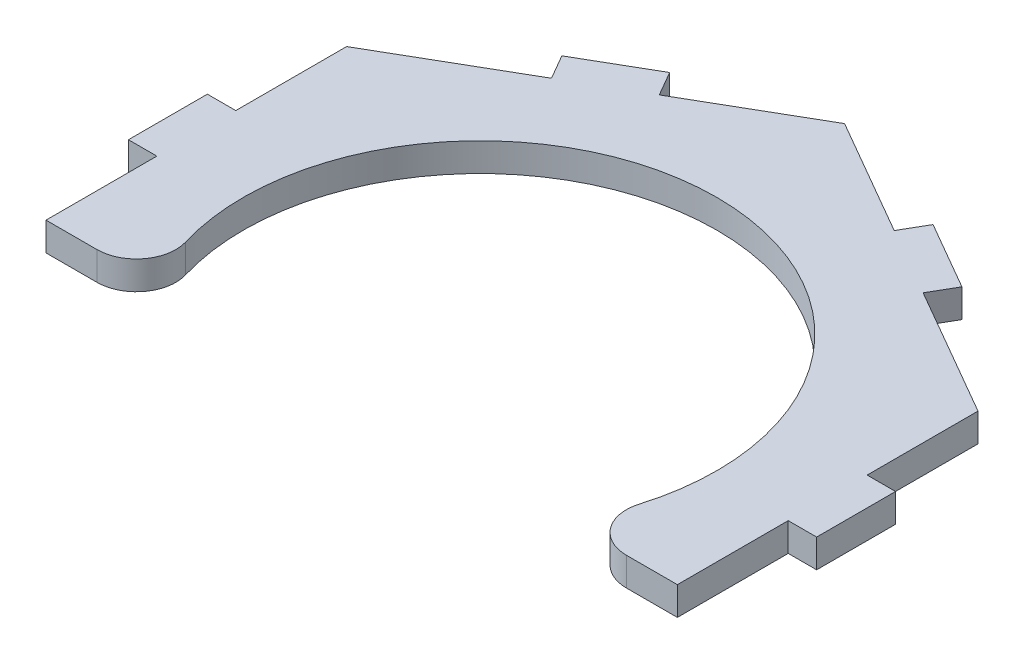
ISO-10303-21;
HEADER;
FILE_DESCRIPTION(('STEP AP214'),'2;1');
FILE_NAME('part.step','',(''),(''),'','','');
FILE_SCHEMA(('AUTOMOTIVE_DESIGN { 1 0 10303 214 1 1 1 1 }'));
ENDSEC;
DATA;
#1=APPLICATION_CONTEXT('core data for automotive mechanical design processes');
#2=APPLICATION_PROTOCOL_DEFINITION('international standard','automotive_design',2000,#1);
#3=PRODUCT_CONTEXT('',#1,'mechanical');
#4=PRODUCT('Part','Part','',(#3));
#5=PRODUCT_RELATED_PRODUCT_CATEGORY('part','',(#4));
#6=PRODUCT_DEFINITION_FORMATION('','',#4);
#7=PRODUCT_DEFINITION_CONTEXT('part definition',#1,'design');
#8=PRODUCT_DEFINITION('design','',#6,#7);
#9=PRODUCT_DEFINITION_SHAPE('','',#8);
#10=(LENGTH_UNIT() NAMED_UNIT(*) SI_UNIT(.MILLI.,.METRE.));
#11=(NAMED_UNIT(*) PLANE_ANGLE_UNIT() SI_UNIT($,.RADIAN.));
#12=(NAMED_UNIT(*) SI_UNIT($,.STERADIAN.) SOLID_ANGLE_UNIT());
#13=UNCERTAINTY_MEASURE_WITH_UNIT(LENGTH_MEASURE(1.E-05),#10,'distance_accuracy_value','');
#14=(GEOMETRIC_REPRESENTATION_CONTEXT(3) GLOBAL_UNCERTAINTY_ASSIGNED_CONTEXT((#13)) GLOBAL_UNIT_ASSIGNED_CONTEXT((#10,
#11,#12)) REPRESENTATION_CONTEXT('',''));
#15=CARTESIAN_POINT('',(0.,0.,0.));
#16=DIRECTION('',(0.,0.,1.));
#17=DIRECTION('',(1.,0.,0.));
#18=AXIS2_PLACEMENT_3D('',#15,#16,#17);
#19=CARTESIAN_POINT('',(50.8,4.572,19.05));
#20=DIRECTION('',(-1.,0.,0.));
#21=DIRECTION('',(0.,0.,1.));
#22=AXIS2_PLACEMENT_3D('',#19,#20,#21);
#23=PLANE('',#22);
#24=DIRECTION('',(0.,1.,0.));
#25=VECTOR('',#24,1.);
#26=CARTESIAN_POINT('',(50.8,0.,-11.4896968374165));
#27=LINE('',#26,#25);
#28=CARTESIAN_POINT('',(50.8,0.,-11.4896968374165));
#29=VERTEX_POINT('',#28);
#30=CARTESIAN_POINT('',(50.8,4.572,-11.4896968374165));
#31=VERTEX_POINT('',#30);
#32=EDGE_CURVE('E214',#29,#31,#27,.T.);
#33=ORIENTED_EDGE('',*,*,#32,.F.);
#34=DIRECTION('',(0.,0.,-1.));
#35=VECTOR('',#34,1.);
#36=CARTESIAN_POINT('',(50.8,0.,19.05));
#37=LINE('',#36,#35);
#38=CARTESIAN_POINT('',(50.8,0.,-29.329393674833));
#39=VERTEX_POINT('',#38);
#40=EDGE_CURVE('E281',#29,#39,#37,.T.);
#41=ORIENTED_EDGE('',*,*,#40,.T.);
#42=DIRECTION('',(0.,-1.,0.));
#43=VECTOR('',#42,1.);
#44=CARTESIAN_POINT('',(50.8,4.572,-29.329393674833));
#45=LINE('',#44,#43);
#46=CARTESIAN_POINT('',(50.8,4.572,-29.329393674833));
#47=VERTEX_POINT('',#46);
#48=EDGE_CURVE('E54',#47,#39,#45,.T.);
#49=ORIENTED_EDGE('',*,*,#48,.F.);
#50=DIRECTION('',(0.,0.,-1.));
#51=VECTOR('',#50,1.);
#52=CARTESIAN_POINT('',(50.8,4.572,19.05));
#53=LINE('',#52,#51);
#54=EDGE_CURVE('E231',#31,#47,#53,.T.);
#55=ORIENTED_EDGE('',*,*,#54,.F.);
#56=EDGE_LOOP('',(#33,#41,#49,#55));
#57=FACE_BOUND('',#56,.T.);
#58=ADVANCED_FACE('F45',(#57),#23,.F.);
#59=CARTESIAN_POINT('',(50.8,4.572,-29.329393674833));
#60=DIRECTION('',(-0.5,0.,0.866025403784439));
#61=DIRECTION('',(0.866025403784439,0.,0.5));
#62=AXIS2_PLACEMENT_3D('',#59,#60,#61);
#63=PLANE('',#62);
#64=DIRECTION('',(-0.866025403784439,0.,-0.5));
#65=VECTOR('',#64,1.);
#66=CARTESIAN_POINT('',(50.8,4.572,-29.329393674833));
#67=LINE('',#66,#65);
#68=CARTESIAN_POINT('',(18.9042843786191,4.572,-47.744393674833));
#69=VERTEX_POINT('',#68);
#70=CARTESIAN_POINT('',(0.,4.572,-58.658787349666));
#71=VERTEX_POINT('',#70);
#72=EDGE_CURVE('E69',#69,#71,#67,.T.);
#73=ORIENTED_EDGE('',*,*,#72,.F.);
#74=DIRECTION('',(0.,1.,0.));
#75=VECTOR('',#74,1.);
#76=CARTESIAN_POINT('',(18.9042843786191,0.,-47.744393674833));
#77=LINE('',#76,#75);
#78=CARTESIAN_POINT('',(18.9042843786191,0.,-47.744393674833));
#79=VERTEX_POINT('',#78);
#80=EDGE_CURVE('E472',#79,#69,#77,.T.);
#81=ORIENTED_EDGE('',*,*,#80,.F.);
#82=DIRECTION('',(-0.866025403784439,0.,-0.5));
#83=VECTOR('',#82,1.);
#84=CARTESIAN_POINT('',(50.8,0.,-29.329393674833));
#85=LINE('',#84,#83);
#86=CARTESIAN_POINT('',(0.,0.,-58.658787349666));
#87=VERTEX_POINT('',#86);
#88=EDGE_CURVE('E287',#79,#87,#85,.T.);
#89=ORIENTED_EDGE('',*,*,#88,.T.);
#90=DIRECTION('',(0.,-1.,0.));
#91=VECTOR('',#90,1.);
#92=CARTESIAN_POINT('',(0.,4.572,-58.658787349666));
#93=LINE('',#92,#91);
#94=EDGE_CURVE('E334',#71,#87,#93,.T.);
#95=ORIENTED_EDGE('',*,*,#94,.F.);
#96=EDGE_LOOP('',(#73,#81,#89,#95));
#97=FACE_BOUND('',#96,.T.);
#98=ADVANCED_FACE('F470',(#97),#63,.F.);
#99=CARTESIAN_POINT('',(0.,4.572,-58.658787349666));
#100=DIRECTION('',(0.5,0.,0.866025403784439));
#101=DIRECTION('',(0.866025403784439,0.,-0.5));
#102=AXIS2_PLACEMENT_3D('',#99,#100,#101);
#103=PLANE('',#102);
#104=DIRECTION('',(-0.866025403784439,0.,0.5));
#105=VECTOR('',#104,1.);
#106=CARTESIAN_POINT('',(0.,4.572,-58.658787349666));
#107=LINE('',#106,#105);
#108=CARTESIAN_POINT('',(-29.9028070066815,4.572,-41.394393674833));
#109=VERTEX_POINT('',#108);
#110=CARTESIAN_POINT('',(-50.8,4.572,-29.329393674833));
#111=VERTEX_POINT('',#110);
#112=EDGE_CURVE('E254',#109,#111,#107,.T.);
#113=ORIENTED_EDGE('',*,*,#112,.F.);
#114=DIRECTION('',(0.,1.,0.));
#115=VECTOR('',#114,1.);
#116=CARTESIAN_POINT('',(-29.9028070066815,0.,-41.394393674833));
#117=LINE('',#116,#115);
#118=CARTESIAN_POINT('',(-29.9028070066815,0.,-41.394393674833));
#119=VERTEX_POINT('',#118);
#120=EDGE_CURVE('E375',#119,#109,#117,.T.);
#121=ORIENTED_EDGE('',*,*,#120,.F.);
#122=DIRECTION('',(-0.866025403784439,0.,0.5));
#123=VECTOR('',#122,1.);
#124=CARTESIAN_POINT('',(0.,0.,-58.658787349666));
#125=LINE('',#124,#123);
#126=CARTESIAN_POINT('',(-50.8,0.,-29.329393674833));
#127=VERTEX_POINT('',#126);
#128=EDGE_CURVE('E291',#119,#127,#125,.T.);
#129=ORIENTED_EDGE('',*,*,#128,.T.);
#130=DIRECTION('',(0.,-1.,0.));
#131=VECTOR('',#130,1.);
#132=CARTESIAN_POINT('',(-50.8,4.572,-29.329393674833));
#133=LINE('',#132,#131);
#134=EDGE_CURVE('E330',#111,#127,#133,.T.);
#135=ORIENTED_EDGE('',*,*,#134,.F.);
#136=EDGE_LOOP('',(#113,#121,#129,#135));
#137=FACE_BOUND('',#136,.T.);
#138=ADVANCED_FACE('F447',(#137),#103,.F.);
#139=CARTESIAN_POINT('',(-50.8,4.572,-29.329393674833));
#140=DIRECTION('',(1.,0.,0.));
#141=DIRECTION('',(0.,0.,-1.));
#142=AXIS2_PLACEMENT_3D('',#139,#140,#141);
#143=PLANE('',#142);
#144=DIRECTION('',(0.,1.,0.));
#145=VECTOR('',#144,1.);
#146=CARTESIAN_POINT('',(-50.8,0.,1.21030316258351));
#147=LINE('',#146,#145);
#148=CARTESIAN_POINT('',(-50.8,0.,1.21030316258351));
#149=VERTEX_POINT('',#148);
#150=CARTESIAN_POINT('',(-50.8,4.572,1.21030316258351));
#151=VERTEX_POINT('',#150);
#152=EDGE_CURVE('E282',#149,#151,#147,.T.);
#153=ORIENTED_EDGE('',*,*,#152,.F.);
#154=DIRECTION('',(0.,0.,1.));
#155=VECTOR('',#154,1.);
#156=CARTESIAN_POINT('',(-50.8,0.,-29.329393674833));
#157=LINE('',#156,#155);
#158=CARTESIAN_POINT('',(-50.8,0.,19.05));
#159=VERTEX_POINT('',#158);
#160=EDGE_CURVE('E295',#149,#159,#157,.T.);
#161=ORIENTED_EDGE('',*,*,#160,.T.);
#162=DIRECTION('',(0.,-1.,0.));
#163=VECTOR('',#162,1.);
#164=CARTESIAN_POINT('',(-50.8,4.572,19.05));
#165=LINE('',#164,#163);
#166=CARTESIAN_POINT('',(-50.8,4.572,19.05));
#167=VERTEX_POINT('',#166);
#168=EDGE_CURVE('E326',#167,#159,#165,.T.);
#169=ORIENTED_EDGE('',*,*,#168,.F.);
#170=DIRECTION('',(0.,0.,1.));
#171=VECTOR('',#170,1.);
#172=CARTESIAN_POINT('',(-50.8,4.572,-29.329393674833));
#173=LINE('',#172,#171);
#174=EDGE_CURVE('E259',#151,#167,#173,.T.);
#175=ORIENTED_EDGE('',*,*,#174,.F.);
#176=EDGE_LOOP('',(#153,#161,#169,#175));
#177=FACE_BOUND('',#176,.T.);
#178=ADVANCED_FACE('F462',(#177),#143,.F.);
#179=CARTESIAN_POINT('',(50.8,4.572,19.05));
#180=DIRECTION('',(0.,0.,-1.));
#181=DIRECTION('',(-1.,0.,0.));
#182=AXIS2_PLACEMENT_3D('',#179,#180,#181);
#183=PLANE('',#182);
#184=DIRECTION('',(1.,0.,0.));
#185=VECTOR('',#184,1.);
#186=CARTESIAN_POINT('',(50.8,0.,19.05));
#187=LINE('',#186,#185);
#188=CARTESIAN_POINT('',(42.597094971371,0.,19.05));
#189=VERTEX_POINT('',#188);
#190=CARTESIAN_POINT('',(50.8,0.,19.05));
#191=VERTEX_POINT('',#190);
#192=EDGE_CURVE('E277',#189,#191,#187,.T.);
#193=ORIENTED_EDGE('',*,*,#192,.T.);
#194=DIRECTION('',(0.,-1.,0.));
#195=VECTOR('',#194,1.);
#196=CARTESIAN_POINT('',(50.8,4.572,19.05));
#197=LINE('',#196,#195);
#198=CARTESIAN_POINT('',(50.8,4.572,19.05));
#199=VERTEX_POINT('',#198);
#200=EDGE_CURVE('E11',#199,#191,#197,.T.);
#201=ORIENTED_EDGE('',*,*,#200,.F.);
#202=DIRECTION('',(1.,0.,0.));
#203=VECTOR('',#202,1.);
#204=CARTESIAN_POINT('',(50.8,4.572,19.05));
#205=LINE('',#204,#203);
#206=CARTESIAN_POINT('',(42.597094971371,4.572,19.05));
#207=VERTEX_POINT('',#206);
#208=EDGE_CURVE('E242',#207,#199,#205,.T.);
#209=ORIENTED_EDGE('',*,*,#208,.F.);
#210=DIRECTION('',(0.,-1.,0.));
#211=VECTOR('',#210,1.);
#212=CARTESIAN_POINT('',(42.597094971371,4.572,19.05));
#213=LINE('',#212,#211);
#214=EDGE_CURVE('E276',#207,#189,#213,.T.);
#215=ORIENTED_EDGE('',*,*,#214,.T.);
#216=EDGE_LOOP('',(#193,#201,#209,#215));
#217=FACE_BOUND('',#216,.T.);
#218=ADVANCED_FACE('F47',(#217),#183,.F.);
#219=CARTESIAN_POINT('',(50.8,0.,1.21030316258351));
#220=VERTEX_POINT('',#219);
#221=EDGE_CURVE('E283',#191,#220,#37,.T.);
#222=ORIENTED_EDGE('',*,*,#221,.T.);
#223=DIRECTION('',(0.,1.,0.));
#224=VECTOR('',#223,1.);
#225=CARTESIAN_POINT('',(50.8,0.,1.21030316258351));
#226=LINE('',#225,#224);
#227=CARTESIAN_POINT('',(50.8,4.572,1.21030316258351));
#228=VERTEX_POINT('',#227);
#229=EDGE_CURVE('E511',#220,#228,#226,.T.);
#230=ORIENTED_EDGE('',*,*,#229,.T.);
#231=EDGE_CURVE('E241',#199,#228,#53,.T.);
#232=ORIENTED_EDGE('',*,*,#231,.F.);
#233=ORIENTED_EDGE('',*,*,#200,.T.);
#234=EDGE_LOOP('',(#222,#230,#232,#233));
#235=FACE_BOUND('',#234,.T.);
#236=ADVANCED_FACE('F510',(#235),#23,.F.);
#237=CARTESIAN_POINT('',(29.9028070066815,0.,-41.394393674833));
#238=VERTEX_POINT('',#237);
#239=EDGE_CURVE('E288',#39,#238,#85,.T.);
#240=ORIENTED_EDGE('',*,*,#239,.T.);
#241=DIRECTION('',(0.,1.,0.));
#242=VECTOR('',#241,1.);
#243=CARTESIAN_POINT('',(29.9028070066815,0.,-41.394393674833));
#244=LINE('',#243,#242);
#245=CARTESIAN_POINT('',(29.9028070066815,4.572,-41.394393674833));
#246=VERTEX_POINT('',#245);
#247=EDGE_CURVE('E534',#238,#246,#244,.T.);
#248=ORIENTED_EDGE('',*,*,#247,.T.);
#249=EDGE_CURVE('E251',#47,#246,#67,.T.);
#250=ORIENTED_EDGE('',*,*,#249,.F.);
#251=ORIENTED_EDGE('',*,*,#48,.T.);
#252=EDGE_LOOP('',(#240,#248,#250,#251));
#253=FACE_BOUND('',#252,.T.);
#254=ADVANCED_FACE('F340',(#253),#63,.F.);
#255=CARTESIAN_POINT('',(-18.9042843786191,0.,-47.744393674833));
#256=VERTEX_POINT('',#255);
#257=EDGE_CURVE('E292',#87,#256,#125,.T.);
#258=ORIENTED_EDGE('',*,*,#257,.T.);
#259=DIRECTION('',(0.,1.,0.));
#260=VECTOR('',#259,1.);
#261=CARTESIAN_POINT('',(-18.9042843786191,0.,-47.744393674833));
#262=LINE('',#261,#260);
#263=CARTESIAN_POINT('',(-18.9042843786191,4.572,-47.744393674833));
#264=VERTEX_POINT('',#263);
#265=EDGE_CURVE('E365',#256,#264,#262,.T.);
#266=ORIENTED_EDGE('',*,*,#265,.T.);
#267=EDGE_CURVE('E255',#71,#264,#107,.T.);
#268=ORIENTED_EDGE('',*,*,#267,.F.);
#269=ORIENTED_EDGE('',*,*,#94,.T.);
#270=EDGE_LOOP('',(#258,#266,#268,#269));
#271=FACE_BOUND('',#270,.T.);
#272=ADVANCED_FACE('F476',(#271),#103,.F.);
#273=CARTESIAN_POINT('',(-50.8,0.,-11.4896968374165));
#274=VERTEX_POINT('',#273);
#275=EDGE_CURVE('E296',#127,#274,#157,.T.);
#276=ORIENTED_EDGE('',*,*,#275,.T.);
#277=DIRECTION('',(0.,1.,0.));
#278=VECTOR('',#277,1.);
#279=CARTESIAN_POINT('',(-50.8,0.,-11.4896968374165));
#280=LINE('',#279,#278);
#281=CARTESIAN_POINT('',(-50.8,4.572,-11.4896968374165));
#282=VERTEX_POINT('',#281);
#283=EDGE_CURVE('E416',#274,#282,#280,.T.);
#284=ORIENTED_EDGE('',*,*,#283,.T.);
#285=EDGE_CURVE('E260',#111,#282,#173,.T.);
#286=ORIENTED_EDGE('',*,*,#285,.F.);
#287=ORIENTED_EDGE('',*,*,#134,.T.);
#288=EDGE_LOOP('',(#276,#284,#286,#287));
#289=FACE_BOUND('',#288,.T.);
#290=ADVANCED_FACE('F438',(#289),#143,.F.);
#291=CARTESIAN_POINT('',(-50.8,4.572,19.05));
#292=DIRECTION('',(0.,0.,-1.));
#293=DIRECTION('',(-1.,0.,0.));
#294=AXIS2_PLACEMENT_3D('',#291,#292,#293);
#295=PLANE('',#294);
#296=DIRECTION('',(1.,0.,0.));
#297=VECTOR('',#296,1.);
#298=CARTESIAN_POINT('',(-50.8,0.,19.05));
#299=LINE('',#298,#297);
#300=CARTESIAN_POINT('',(-42.597094971371,0.,19.05));
#301=VERTEX_POINT('',#300);
#302=EDGE_CURVE('E300',#159,#301,#299,.T.);
#303=ORIENTED_EDGE('',*,*,#302,.T.);
#304=DIRECTION('',(0.,-1.,0.));
#305=VECTOR('',#304,1.);
#306=CARTESIAN_POINT('',(-42.597094971371,4.572,19.05));
#307=LINE('',#306,#305);
#308=CARTESIAN_POINT('',(-42.597094971371,4.572,19.05));
#309=VERTEX_POINT('',#308);
#310=EDGE_CURVE('E322',#309,#301,#307,.T.);
#311=ORIENTED_EDGE('',*,*,#310,.F.);
#312=DIRECTION('',(1.,0.,0.));
#313=VECTOR('',#312,1.);
#314=CARTESIAN_POINT('',(-50.8,4.572,19.05));
#315=LINE('',#314,#313);
#316=EDGE_CURVE('E264',#167,#309,#315,.T.);
#317=ORIENTED_EDGE('',*,*,#316,.F.);
#318=ORIENTED_EDGE('',*,*,#168,.T.);
#319=EDGE_LOOP('',(#303,#311,#317,#318));
#320=FACE_BOUND('',#319,.T.);
#321=ADVANCED_FACE('F491',(#320),#295,.F.);
#322=CARTESIAN_POINT('',(-42.597094971371,4.572,12.7));
#323=DIRECTION('',(0.,-1.,0.));
#324=DIRECTION('',(0.,0.,-1.));
#325=AXIS2_PLACEMENT_3D('',#322,#323,#324);
#326=CYLINDRICAL_SURFACE('',#325,6.35);
#327=CARTESIAN_POINT('',(-42.597094971371,0.,12.7));
#328=DIRECTION('',(0.,1.,0.));
#329=DIRECTION('',(0.,0.,1.));
#330=AXIS2_PLACEMENT_3D('',#327,#328,#329);
#331=CIRCLE('',#330,6.35);
#332=CARTESIAN_POINT('',(-36.5117956897466,0.,10.8857142857143));
#333=VERTEX_POINT('',#332);
#334=EDGE_CURVE('E303',#301,#333,#331,.T.);
#335=ORIENTED_EDGE('',*,*,#334,.T.);
#336=DIRECTION('',(0.,-1.,0.));
#337=VECTOR('',#336,1.);
#338=CARTESIAN_POINT('',(-36.5117956897466,4.572,10.8857142857143));
#339=LINE('',#338,#337);
#340=CARTESIAN_POINT('',(-36.5117956897466,4.572,10.8857142857143));
#341=VERTEX_POINT('',#340);
#342=EDGE_CURVE('E318',#341,#333,#339,.T.);
#343=ORIENTED_EDGE('',*,*,#342,.F.);
#344=CARTESIAN_POINT('',(-42.597094971371,4.572,12.7));
#345=DIRECTION('',(0.,1.,0.));
#346=DIRECTION('',(0.,0.,1.));
#347=AXIS2_PLACEMENT_3D('',#344,#345,#346);
#348=CIRCLE('',#347,6.35);
#349=EDGE_CURVE('E267',#309,#341,#348,.T.);
#350=ORIENTED_EDGE('',*,*,#349,.F.);
#351=ORIENTED_EDGE('',*,*,#310,.T.);
#352=EDGE_LOOP('',(#335,#343,#350,#351));
#353=FACE_BOUND('',#352,.T.);
#354=ADVANCED_FACE('F495',(#353),#326,.T.);
#355=CARTESIAN_POINT('',(0.,4.572,0.));
#356=DIRECTION('',(0.,-1.,0.));
#357=DIRECTION('',(0.,0.,-1.));
#358=AXIS2_PLACEMENT_3D('',#355,#356,#357);
#359=CYLINDRICAL_SURFACE('',#358,38.1);
#360=CARTESIAN_POINT('',(0.,0.,0.));
#361=DIRECTION('',(0.,-1.,0.));
#362=DIRECTION('',(0.,0.,1.));
#363=AXIS2_PLACEMENT_3D('',#360,#361,#362);
#364=CIRCLE('',#363,38.1);
#365=CARTESIAN_POINT('',(36.5117956897466,0.,10.8857142857143));
#366=VERTEX_POINT('',#365);
#367=EDGE_CURVE('E306',#333,#366,#364,.T.);
#368=ORIENTED_EDGE('',*,*,#367,.T.);
#369=DIRECTION('',(0.,-1.,0.));
#370=VECTOR('',#369,1.);
#371=CARTESIAN_POINT('',(36.5117956897466,4.572,10.8857142857143));
#372=LINE('',#371,#370);
#373=CARTESIAN_POINT('',(36.5117956897466,4.572,10.8857142857143));
#374=VERTEX_POINT('',#373);
#375=EDGE_CURVE('E314',#374,#366,#372,.T.);
#376=ORIENTED_EDGE('',*,*,#375,.F.);
#377=CARTESIAN_POINT('',(0.,4.572,0.));
#378=DIRECTION('',(0.,-1.,0.));
#379=DIRECTION('',(0.,0.,1.));
#380=AXIS2_PLACEMENT_3D('',#377,#378,#379);
#381=CIRCLE('',#380,38.1);
#382=EDGE_CURVE('E270',#341,#374,#381,.T.);
#383=ORIENTED_EDGE('',*,*,#382,.F.);
#384=ORIENTED_EDGE('',*,*,#342,.T.);
#385=EDGE_LOOP('',(#368,#376,#383,#384));
#386=FACE_BOUND('',#385,.T.);
#387=ADVANCED_FACE('F501',(#386),#359,.F.);
#388=CARTESIAN_POINT('',(42.597094971371,4.572,12.7));
#389=DIRECTION('',(0.,-1.,0.));
#390=DIRECTION('',(0.,0.,-1.));
#391=AXIS2_PLACEMENT_3D('',#388,#389,#390);
#392=CYLINDRICAL_SURFACE('',#391,6.35);
#393=CARTESIAN_POINT('',(42.597094971371,0.,12.7));
#394=DIRECTION('',(0.,1.,0.));
#395=DIRECTION('',(0.,0.,-1.));
#396=AXIS2_PLACEMENT_3D('',#393,#394,#395);
#397=CIRCLE('',#396,6.35);
#398=EDGE_CURVE('E247',#366,#189,#397,.T.);
#399=ORIENTED_EDGE('',*,*,#398,.T.);
#400=ORIENTED_EDGE('',*,*,#214,.F.);
#401=CARTESIAN_POINT('',(42.597094971371,4.572,12.7));
#402=DIRECTION('',(0.,1.,0.));
#403=DIRECTION('',(0.,0.,-1.));
#404=AXIS2_PLACEMENT_3D('',#401,#402,#403);
#405=CIRCLE('',#404,6.35);
#406=EDGE_CURVE('E273',#374,#207,#405,.T.);
#407=ORIENTED_EDGE('',*,*,#406,.F.);
#408=ORIENTED_EDGE('',*,*,#375,.T.);
#409=EDGE_LOOP('',(#399,#400,#407,#408));
#410=FACE_BOUND('',#409,.T.);
#411=ADVANCED_FACE('F505',(#410),#392,.T.);
#412=CARTESIAN_POINT('',(42.597094971371,4.572,12.7));
#413=DIRECTION('',(0.,-1.,0.));
#414=DIRECTION('',(0.,0.,-1.));
#415=AXIS2_PLACEMENT_3D('',#412,#413,#414);
#416=PLANE('',#415);
#417=ORIENTED_EDGE('',*,*,#208,.T.);
#418=ORIENTED_EDGE('',*,*,#231,.T.);
#419=DIRECTION('',(1.,0.,0.));
#420=VECTOR('',#419,1.);
#421=CARTESIAN_POINT('',(55.372,4.572,1.21030316258351));
#422=LINE('',#421,#420);
#423=CARTESIAN_POINT('',(55.372,4.572,1.21030316258351));
#424=VERTEX_POINT('',#423);
#425=EDGE_CURVE('E61',#228,#424,#422,.T.);
#426=ORIENTED_EDGE('',*,*,#425,.T.);
#427=DIRECTION('',(0.,0.,-1.));
#428=VECTOR('',#427,1.);
#429=CARTESIAN_POINT('',(55.372,4.572,-11.4896968374165));
#430=LINE('',#429,#428);
#431=CARTESIAN_POINT('',(55.372,4.572,-11.4896968374165));
#432=VERTEX_POINT('',#431);
#433=EDGE_CURVE('E234',#424,#432,#430,.T.);
#434=ORIENTED_EDGE('',*,*,#433,.T.);
#435=DIRECTION('',(-1.,0.,0.));
#436=VECTOR('',#435,1.);
#437=CARTESIAN_POINT('',(50.8,4.572,-11.4896968374165));
#438=LINE('',#437,#436);
#439=EDGE_CURVE('E217',#432,#31,#438,.T.);
#440=ORIENTED_EDGE('',*,*,#439,.T.);
#441=ORIENTED_EDGE('',*,*,#54,.T.);
#442=ORIENTED_EDGE('',*,*,#249,.T.);
#443=DIRECTION('',(0.500000000000002,0.,-0.866025403784438));
#444=VECTOR('',#443,1.);
#445=CARTESIAN_POINT('',(32.1888070066815,4.572,-45.3538618209354));
#446=LINE('',#445,#444);
#447=CARTESIAN_POINT('',(32.1888070066815,4.572,-45.3538618209354));
#448=VERTEX_POINT('',#447);
#449=EDGE_CURVE('E379',#246,#448,#446,.T.);
#450=ORIENTED_EDGE('',*,*,#449,.T.);
#451=DIRECTION('',(-0.866025403784438,0.,-0.5));
#452=VECTOR('',#451,1.);
#453=CARTESIAN_POINT('',(21.1902843786191,4.572,-51.7038618209354));
#454=LINE('',#453,#452);
#455=CARTESIAN_POINT('',(21.1902843786191,4.572,-51.7038618209354));
#456=VERTEX_POINT('',#455);
#457=EDGE_CURVE('E359',#448,#456,#454,.T.);
#458=ORIENTED_EDGE('',*,*,#457,.T.);
#459=DIRECTION('',(-0.5,0.,0.866025403784438));
#460=VECTOR('',#459,1.);
#461=CARTESIAN_POINT('',(18.9042843786191,4.572,-47.744393674833));
#462=LINE('',#461,#460);
#463=EDGE_CURVE('E354',#456,#69,#462,.T.);
#464=ORIENTED_EDGE('',*,*,#463,.T.);
#465=ORIENTED_EDGE('',*,*,#72,.T.);
#466=ORIENTED_EDGE('',*,*,#267,.T.);
#467=DIRECTION('',(-0.5,0.,-0.866025403784438));
#468=VECTOR('',#467,1.);
#469=CARTESIAN_POINT('',(-21.1902843786191,4.572,-51.7038618209354));
#470=LINE('',#469,#468);
#471=CARTESIAN_POINT('',(-21.1902843786191,4.572,-51.7038618209354));
#472=VERTEX_POINT('',#471);
#473=EDGE_CURVE('E389',#264,#472,#470,.T.);
#474=ORIENTED_EDGE('',*,*,#473,.T.);
#475=DIRECTION('',(-0.866025403784439,0.,0.5));
#476=VECTOR('',#475,1.);
#477=CARTESIAN_POINT('',(-32.1888070066815,4.572,-45.3538618209354));
#478=LINE('',#477,#476);
#479=CARTESIAN_POINT('',(-32.1888070066815,4.572,-45.3538618209354));
#480=VERTEX_POINT('',#479);
#481=EDGE_CURVE('E384',#472,#480,#478,.T.);
#482=ORIENTED_EDGE('',*,*,#481,.T.);
#483=DIRECTION('',(0.5,0.,0.866025403784438));
#484=VECTOR('',#483,1.);
#485=CARTESIAN_POINT('',(-29.9028070066815,4.572,-41.394393674833));
#486=LINE('',#485,#484);
#487=EDGE_CURVE('E380',#480,#109,#486,.T.);
#488=ORIENTED_EDGE('',*,*,#487,.T.);
#489=ORIENTED_EDGE('',*,*,#112,.T.);
#490=ORIENTED_EDGE('',*,*,#285,.T.);
#491=DIRECTION('',(-1.,0.,0.));
#492=VECTOR('',#491,1.);
#493=CARTESIAN_POINT('',(-50.8,4.572,-11.4896968374165));
#494=LINE('',#493,#492);
#495=CARTESIAN_POINT('',(-55.372,4.572,-11.4896968374165));
#496=VERTEX_POINT('',#495);
#497=EDGE_CURVE('E393',#282,#496,#494,.T.);
#498=ORIENTED_EDGE('',*,*,#497,.T.);
#499=DIRECTION('',(0.,0.,1.));
#500=VECTOR('',#499,1.);
#501=CARTESIAN_POINT('',(-55.372,4.572,-11.4896968374165));
#502=LINE('',#501,#500);
#503=CARTESIAN_POINT('',(-55.372,4.572,1.21030316258352));
#504=VERTEX_POINT('',#503);
#505=EDGE_CURVE('E420',#496,#504,#502,.T.);
#506=ORIENTED_EDGE('',*,*,#505,.T.);
#507=DIRECTION('',(1.,0.,0.));
#508=VECTOR('',#507,1.);
#509=CARTESIAN_POINT('',(-55.372,4.572,1.21030316258352));
#510=LINE('',#509,#508);
#511=EDGE_CURVE('E409',#504,#151,#510,.T.);
#512=ORIENTED_EDGE('',*,*,#511,.T.);
#513=ORIENTED_EDGE('',*,*,#174,.T.);
#514=ORIENTED_EDGE('',*,*,#316,.T.);
#515=ORIENTED_EDGE('',*,*,#349,.T.);
#516=ORIENTED_EDGE('',*,*,#382,.T.);
#517=ORIENTED_EDGE('',*,*,#406,.T.);
#518=EDGE_LOOP('',(#417,#418,#426,#434,#440,#441,#442,#450,#458,#464,#465,#466,#474,#482,#488,
#489,#490,#498,#506,#512,#513,#514,#515,#516,#517));
#519=FACE_BOUND('',#518,.T.);
#520=ADVANCED_FACE('F229',(#519),#416,.F.);
#521=CARTESIAN_POINT('',(42.597094971371,0.,12.7));
#522=DIRECTION('',(0.,-1.,0.));
#523=DIRECTION('',(0.,0.,-1.));
#524=AXIS2_PLACEMENT_3D('',#521,#522,#523);
#525=PLANE('',#524);
#526=ORIENTED_EDGE('',*,*,#192,.F.);
#527=ORIENTED_EDGE('',*,*,#398,.F.);
#528=ORIENTED_EDGE('',*,*,#367,.F.);
#529=ORIENTED_EDGE('',*,*,#334,.F.);
#530=ORIENTED_EDGE('',*,*,#302,.F.);
#531=ORIENTED_EDGE('',*,*,#160,.F.);
#532=DIRECTION('',(1.,0.,0.));
#533=VECTOR('',#532,1.);
#534=CARTESIAN_POINT('',(-55.372,0.,1.21030316258352));
#535=LINE('',#534,#533);
#536=CARTESIAN_POINT('',(-55.372,0.,1.21030316258352));
#537=VERTEX_POINT('',#536);
#538=EDGE_CURVE('E413',#537,#149,#535,.T.);
#539=ORIENTED_EDGE('',*,*,#538,.F.);
#540=DIRECTION('',(0.,0.,1.));
#541=VECTOR('',#540,1.);
#542=CARTESIAN_POINT('',(-55.372,0.,-11.4896968374165));
#543=LINE('',#542,#541);
#544=CARTESIAN_POINT('',(-55.372,0.,-11.4896968374165));
#545=VERTEX_POINT('',#544);
#546=EDGE_CURVE('E408',#545,#537,#543,.T.);
#547=ORIENTED_EDGE('',*,*,#546,.F.);
#548=DIRECTION('',(-1.,0.,0.));
#549=VECTOR('',#548,1.);
#550=CARTESIAN_POINT('',(-50.8,0.,-11.4896968374165));
#551=LINE('',#550,#549);
#552=EDGE_CURVE('E404',#274,#545,#551,.T.);
#553=ORIENTED_EDGE('',*,*,#552,.F.);
#554=ORIENTED_EDGE('',*,*,#275,.F.);
#555=ORIENTED_EDGE('',*,*,#128,.F.);
#556=DIRECTION('',(0.5,0.,0.866025403784438));
#557=VECTOR('',#556,1.);
#558=CARTESIAN_POINT('',(-29.9028070066815,0.,-41.394393674833));
#559=LINE('',#558,#557);
#560=CARTESIAN_POINT('',(-32.1888070066815,0.,-45.3538618209354));
#561=VERTEX_POINT('',#560);
#562=EDGE_CURVE('E368',#561,#119,#559,.T.);
#563=ORIENTED_EDGE('',*,*,#562,.F.);
#564=DIRECTION('',(-0.866025403784439,0.,0.5));
#565=VECTOR('',#564,1.);
#566=CARTESIAN_POINT('',(-32.1888070066815,0.,-45.3538618209354));
#567=LINE('',#566,#565);
#568=CARTESIAN_POINT('',(-21.1902843786191,0.,-51.7038618209354));
#569=VERTEX_POINT('',#568);
#570=EDGE_CURVE('E397',#569,#561,#567,.T.);
#571=ORIENTED_EDGE('',*,*,#570,.F.);
#572=DIRECTION('',(-0.5,0.,-0.866025403784438));
#573=VECTOR('',#572,1.);
#574=CARTESIAN_POINT('',(-21.1902843786191,0.,-51.7038618209354));
#575=LINE('',#574,#573);
#576=EDGE_CURVE('E385',#256,#569,#575,.T.);
#577=ORIENTED_EDGE('',*,*,#576,.F.);
#578=ORIENTED_EDGE('',*,*,#257,.F.);
#579=ORIENTED_EDGE('',*,*,#88,.F.);
#580=DIRECTION('',(-0.5,0.,0.866025403784438));
#581=VECTOR('',#580,1.);
#582=CARTESIAN_POINT('',(18.9042843786191,0.,-47.744393674833));
#583=LINE('',#582,#581);
#584=CARTESIAN_POINT('',(21.1902843786191,0.,-51.7038618209354));
#585=VERTEX_POINT('',#584);
#586=EDGE_CURVE('E361',#585,#79,#583,.T.);
#587=ORIENTED_EDGE('',*,*,#586,.F.);
#588=DIRECTION('',(-0.866025403784438,0.,-0.5));
#589=VECTOR('',#588,1.);
#590=CARTESIAN_POINT('',(21.1902843786191,0.,-51.7038618209354));
#591=LINE('',#590,#589);
#592=CARTESIAN_POINT('',(32.1888070066815,0.,-45.3538618209354));
#593=VERTEX_POINT('',#592);
#594=EDGE_CURVE('E351',#593,#585,#591,.T.);
#595=ORIENTED_EDGE('',*,*,#594,.F.);
#596=DIRECTION('',(0.500000000000002,0.,-0.866025403784438));
#597=VECTOR('',#596,1.);
#598=CARTESIAN_POINT('',(32.1888070066815,0.,-45.3538618209354));
#599=LINE('',#598,#597);
#600=EDGE_CURVE('E348',#238,#593,#599,.T.);
#601=ORIENTED_EDGE('',*,*,#600,.F.);
#602=ORIENTED_EDGE('',*,*,#239,.F.);
#603=ORIENTED_EDGE('',*,*,#40,.F.);
#604=DIRECTION('',(-1.,0.,0.));
#605=VECTOR('',#604,1.);
#606=CARTESIAN_POINT('',(50.8,0.,-11.4896968374165));
#607=LINE('',#606,#605);
#608=CARTESIAN_POINT('',(55.372,0.,-11.4896968374165));
#609=VERTEX_POINT('',#608);
#610=EDGE_CURVE('E219',#609,#29,#607,.T.);
#611=ORIENTED_EDGE('',*,*,#610,.F.);
#612=DIRECTION('',(0.,0.,-1.));
#613=VECTOR('',#612,1.);
#614=CARTESIAN_POINT('',(55.372,0.,-11.4896968374165));
#615=LINE('',#614,#613);
#616=CARTESIAN_POINT('',(55.372,0.,1.21030316258351));
#617=VERTEX_POINT('',#616);
#618=EDGE_CURVE('E519',#617,#609,#615,.T.);
#619=ORIENTED_EDGE('',*,*,#618,.F.);
#620=DIRECTION('',(1.,0.,0.));
#621=VECTOR('',#620,1.);
#622=CARTESIAN_POINT('',(55.372,0.,1.21030316258351));
#623=LINE('',#622,#621);
#624=EDGE_CURVE('E236',#220,#617,#623,.T.);
#625=ORIENTED_EDGE('',*,*,#624,.F.);
#626=ORIENTED_EDGE('',*,*,#221,.F.);
#627=EDGE_LOOP('',(#526,#527,#528,#529,#530,#531,#539,#547,#553,#554,#555,#563,#571,#577,#578,
#579,#587,#595,#601,#602,#603,#611,#619,#625,#626));
#628=FACE_BOUND('',#627,.T.);
#629=ADVANCED_FACE('F345',(#628),#525,.T.);
#630=CARTESIAN_POINT('',(-55.372,0.,1.21030316258352));
#631=DIRECTION('',(0.,0.,1.));
#632=DIRECTION('',(1.,0.,0.));
#633=AXIS2_PLACEMENT_3D('',#630,#631,#632);
#634=PLANE('',#633);
#635=ORIENTED_EDGE('',*,*,#511,.F.);
#636=DIRECTION('',(0.,1.,0.));
#637=VECTOR('',#636,1.);
#638=CARTESIAN_POINT('',(-55.372,0.,1.21030316258352));
#639=LINE('',#638,#637);
#640=EDGE_CURVE('E429',#537,#504,#639,.T.);
#641=ORIENTED_EDGE('',*,*,#640,.F.);
#642=ORIENTED_EDGE('',*,*,#538,.T.);
#643=ORIENTED_EDGE('',*,*,#152,.T.);
#644=EDGE_LOOP('',(#635,#641,#642,#643));
#645=FACE_BOUND('',#644,.T.);
#646=ADVANCED_FACE('F458',(#645),#634,.T.);
#647=CARTESIAN_POINT('',(-55.372,0.,-11.4896968374165));
#648=DIRECTION('',(-1.,0.,0.));
#649=DIRECTION('',(0.,0.,1.));
#650=AXIS2_PLACEMENT_3D('',#647,#648,#649);
#651=PLANE('',#650);
#652=ORIENTED_EDGE('',*,*,#505,.F.);
#653=DIRECTION('',(0.,1.,0.));
#654=VECTOR('',#653,1.);
#655=CARTESIAN_POINT('',(-55.372,0.,-11.4896968374165));
#656=LINE('',#655,#654);
#657=EDGE_CURVE('E432',#545,#496,#656,.T.);
#658=ORIENTED_EDGE('',*,*,#657,.F.);
#659=ORIENTED_EDGE('',*,*,#546,.T.);
#660=ORIENTED_EDGE('',*,*,#640,.T.);
#661=EDGE_LOOP('',(#652,#658,#659,#660));
#662=FACE_BOUND('',#661,.T.);
#663=ADVANCED_FACE('F454',(#662),#651,.T.);
#664=CARTESIAN_POINT('',(-50.8,0.,-11.4896968374165));
#665=DIRECTION('',(0.,0.,-1.));
#666=DIRECTION('',(-1.,0.,0.));
#667=AXIS2_PLACEMENT_3D('',#664,#665,#666);
#668=PLANE('',#667);
#669=ORIENTED_EDGE('',*,*,#497,.F.);
#670=ORIENTED_EDGE('',*,*,#283,.F.);
#671=ORIENTED_EDGE('',*,*,#552,.T.);
#672=ORIENTED_EDGE('',*,*,#657,.T.);
#673=EDGE_LOOP('',(#669,#670,#671,#672));
#674=FACE_BOUND('',#673,.T.);
#675=ADVANCED_FACE('F451',(#674),#668,.T.);
#676=CARTESIAN_POINT('',(-29.9028070066815,0.,-41.394393674833));
#677=DIRECTION('',(-0.866025403784438,0.,0.5));
#678=DIRECTION('',(0.5,0.,0.866025403784439));
#679=AXIS2_PLACEMENT_3D('',#676,#677,#678);
#680=PLANE('',#679);
#681=ORIENTED_EDGE('',*,*,#487,.F.);
#682=DIRECTION('',(0.,1.,0.));
#683=VECTOR('',#682,1.);
#684=CARTESIAN_POINT('',(-32.1888070066815,0.,-45.3538618209354));
#685=LINE('',#684,#683);
#686=EDGE_CURVE('E372',#561,#480,#685,.T.);
#687=ORIENTED_EDGE('',*,*,#686,.F.);
#688=ORIENTED_EDGE('',*,*,#562,.T.);
#689=ORIENTED_EDGE('',*,*,#120,.T.);
#690=EDGE_LOOP('',(#681,#687,#688,#689));
#691=FACE_BOUND('',#690,.T.);
#692=ADVANCED_FACE('F696',(#691),#680,.T.);
#693=CARTESIAN_POINT('',(-32.1888070066815,0.,-45.3538618209354));
#694=DIRECTION('',(-0.5,0.,-0.866025403784439));
#695=DIRECTION('',(-0.866025403784439,0.,0.5));
#696=AXIS2_PLACEMENT_3D('',#693,#694,#695);
#697=PLANE('',#696);
#698=ORIENTED_EDGE('',*,*,#481,.F.);
#699=DIRECTION('',(0.,1.,0.));
#700=VECTOR('',#699,1.);
#701=CARTESIAN_POINT('',(-21.1902843786191,0.,-51.7038618209354));
#702=LINE('',#701,#700);
#703=EDGE_CURVE('E369',#569,#472,#702,.T.);
#704=ORIENTED_EDGE('',*,*,#703,.F.);
#705=ORIENTED_EDGE('',*,*,#570,.T.);
#706=ORIENTED_EDGE('',*,*,#686,.T.);
#707=EDGE_LOOP('',(#698,#704,#705,#706));
#708=FACE_BOUND('',#707,.T.);
#709=ADVANCED_FACE('F704',(#708),#697,.T.);
#710=CARTESIAN_POINT('',(-21.1902843786191,0.,-51.7038618209354));
#711=DIRECTION('',(0.866025403784438,0.,-0.5));
#712=DIRECTION('',(-0.5,0.,-0.866025403784439));
#713=AXIS2_PLACEMENT_3D('',#710,#711,#712);
#714=PLANE('',#713);
#715=ORIENTED_EDGE('',*,*,#473,.F.);
#716=ORIENTED_EDGE('',*,*,#265,.F.);
#717=ORIENTED_EDGE('',*,*,#576,.T.);
#718=ORIENTED_EDGE('',*,*,#703,.T.);
#719=EDGE_LOOP('',(#715,#716,#717,#718));
#720=FACE_BOUND('',#719,.T.);
#721=ADVANCED_FACE('F482',(#720),#714,.T.);
#722=CARTESIAN_POINT('',(18.9042843786191,0.,-47.744393674833));
#723=DIRECTION('',(-0.866025403784438,0.,-0.5));
#724=DIRECTION('',(-0.5,0.,0.866025403784439));
#725=AXIS2_PLACEMENT_3D('',#722,#723,#724);
#726=PLANE('',#725);
#727=ORIENTED_EDGE('',*,*,#463,.F.);
#728=DIRECTION('',(0.,1.,0.));
#729=VECTOR('',#728,1.);
#730=CARTESIAN_POINT('',(21.1902843786191,0.,-51.7038618209354));
#731=LINE('',#730,#729);
#732=EDGE_CURVE('E540',#585,#456,#731,.T.);
#733=ORIENTED_EDGE('',*,*,#732,.F.);
#734=ORIENTED_EDGE('',*,*,#586,.T.);
#735=ORIENTED_EDGE('',*,*,#80,.T.);
#736=EDGE_LOOP('',(#727,#733,#734,#735));
#737=FACE_BOUND('',#736,.T.);
#738=ADVANCED_FACE('F551',(#737),#726,.T.);
#739=CARTESIAN_POINT('',(21.1902843786191,0.,-51.7038618209354));
#740=DIRECTION('',(0.5,0.,-0.866025403784438));
#741=DIRECTION('',(-0.866025403784438,0.,-0.5));
#742=AXIS2_PLACEMENT_3D('',#739,#740,#741);
#743=PLANE('',#742);
#744=ORIENTED_EDGE('',*,*,#457,.F.);
#745=DIRECTION('',(0.,1.,0.));
#746=VECTOR('',#745,1.);
#747=CARTESIAN_POINT('',(32.1888070066815,0.,-45.3538618209354));
#748=LINE('',#747,#746);
#749=EDGE_CURVE('E537',#593,#448,#748,.T.);
#750=ORIENTED_EDGE('',*,*,#749,.F.);
#751=ORIENTED_EDGE('',*,*,#594,.T.);
#752=ORIENTED_EDGE('',*,*,#732,.T.);
#753=EDGE_LOOP('',(#744,#750,#751,#752));
#754=FACE_BOUND('',#753,.T.);
#755=ADVANCED_FACE('F554',(#754),#743,.T.);
#756=CARTESIAN_POINT('',(32.1888070066815,0.,-45.3538618209354));
#757=DIRECTION('',(0.866025403784438,0.,0.500000000000001));
#758=DIRECTION('',(0.500000000000001,0.,-0.866025403784438));
#759=AXIS2_PLACEMENT_3D('',#756,#757,#758);
#760=PLANE('',#759);
#761=ORIENTED_EDGE('',*,*,#449,.F.);
#762=ORIENTED_EDGE('',*,*,#247,.F.);
#763=ORIENTED_EDGE('',*,*,#600,.T.);
#764=ORIENTED_EDGE('',*,*,#749,.T.);
#765=EDGE_LOOP('',(#761,#762,#763,#764));
#766=FACE_BOUND('',#765,.T.);
#767=ADVANCED_FACE('F556',(#766),#760,.T.);
#768=CARTESIAN_POINT('',(50.8,0.,-11.4896968374165));
#769=DIRECTION('',(0.,0.,-1.));
#770=DIRECTION('',(-1.,0.,0.));
#771=AXIS2_PLACEMENT_3D('',#768,#769,#770);
#772=PLANE('',#771);
#773=ORIENTED_EDGE('',*,*,#439,.F.);
#774=DIRECTION('',(0.,1.,0.));
#775=VECTOR('',#774,1.);
#776=CARTESIAN_POINT('',(55.372,0.,-11.4896968374165));
#777=LINE('',#776,#775);
#778=EDGE_CURVE('E224',#609,#432,#777,.T.);
#779=ORIENTED_EDGE('',*,*,#778,.F.);
#780=ORIENTED_EDGE('',*,*,#610,.T.);
#781=ORIENTED_EDGE('',*,*,#32,.T.);
#782=EDGE_LOOP('',(#773,#779,#780,#781));
#783=FACE_BOUND('',#782,.T.);
#784=ADVANCED_FACE('F216',(#783),#772,.T.);
#785=CARTESIAN_POINT('',(55.372,0.,-11.4896968374165));
#786=DIRECTION('',(1.,0.,0.));
#787=DIRECTION('',(0.,0.,-1.));
#788=AXIS2_PLACEMENT_3D('',#785,#786,#787);
#789=PLANE('',#788);
#790=ORIENTED_EDGE('',*,*,#433,.F.);
#791=DIRECTION('',(0.,1.,0.));
#792=VECTOR('',#791,1.);
#793=CARTESIAN_POINT('',(55.372,0.,1.21030316258351));
#794=LINE('',#793,#792);
#795=EDGE_CURVE('E515',#617,#424,#794,.T.);
#796=ORIENTED_EDGE('',*,*,#795,.F.);
#797=ORIENTED_EDGE('',*,*,#618,.T.);
#798=ORIENTED_EDGE('',*,*,#778,.T.);
#799=EDGE_LOOP('',(#790,#796,#797,#798));
#800=FACE_BOUND('',#799,.T.);
#801=ADVANCED_FACE('F563',(#800),#789,.T.);
#802=CARTESIAN_POINT('',(55.372,0.,1.21030316258351));
#803=DIRECTION('',(0.,0.,1.));
#804=DIRECTION('',(1.,0.,0.));
#805=AXIS2_PLACEMENT_3D('',#802,#803,#804);
#806=PLANE('',#805);
#807=ORIENTED_EDGE('',*,*,#425,.F.);
#808=ORIENTED_EDGE('',*,*,#229,.F.);
#809=ORIENTED_EDGE('',*,*,#624,.T.);
#810=ORIENTED_EDGE('',*,*,#795,.T.);
#811=EDGE_LOOP('',(#807,#808,#809,#810));
#812=FACE_BOUND('',#811,.T.);
#813=ADVANCED_FACE('F749',(#812),#806,.T.);
#814=CLOSED_SHELL('',(#58,#98,#138,#178,#218,#236,#254,#272,#290,#321,#354,#387,#411,#520,#629,
#646,#663,#675,#692,#709,#721,#738,#755,#767,#784,#801,#813));
#815=MANIFOLD_SOLID_BREP('B2',#814);
#816=ADVANCED_BREP_SHAPE_REPRESENTATION('',(#18,#815),#14);
#817=SHAPE_DEFINITION_REPRESENTATION(#9,#816);
ENDSEC;
END-ISO-10303-21;
